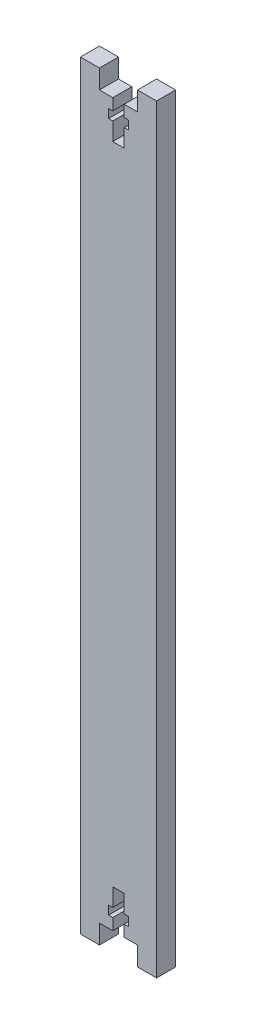
ISO-10303-21;
HEADER;
FILE_DESCRIPTION(('STEP AP214'),'2;1');
FILE_NAME('part.step','',(''),(''),'','','');
FILE_SCHEMA(('AUTOMOTIVE_DESIGN { 1 0 10303 214 1 1 1 1 }'));
ENDSEC;
DATA;
#1=APPLICATION_CONTEXT('core data for automotive mechanical design processes');
#2=APPLICATION_PROTOCOL_DEFINITION('international standard','automotive_design',2000,#1);
#3=PRODUCT_CONTEXT('',#1,'mechanical');
#4=PRODUCT('Part','Part','',(#3));
#5=PRODUCT_RELATED_PRODUCT_CATEGORY('part','',(#4));
#6=PRODUCT_DEFINITION_FORMATION('','',#4);
#7=PRODUCT_DEFINITION_CONTEXT('part definition',#1,'design');
#8=PRODUCT_DEFINITION('design','',#6,#7);
#9=PRODUCT_DEFINITION_SHAPE('','',#8);
#10=(LENGTH_UNIT() NAMED_UNIT(*) SI_UNIT(.MILLI.,.METRE.));
#11=(NAMED_UNIT(*) PLANE_ANGLE_UNIT() SI_UNIT($,.RADIAN.));
#12=(NAMED_UNIT(*) SI_UNIT($,.STERADIAN.) SOLID_ANGLE_UNIT());
#13=UNCERTAINTY_MEASURE_WITH_UNIT(LENGTH_MEASURE(1.E-05),#10,'distance_accuracy_value','');
#14=(GEOMETRIC_REPRESENTATION_CONTEXT(3) GLOBAL_UNCERTAINTY_ASSIGNED_CONTEXT((#13)) GLOBAL_UNIT_ASSIGNED_CONTEXT((#10,
#11,#12)) REPRESENTATION_CONTEXT('',''));
#15=CARTESIAN_POINT('',(0.,0.,0.));
#16=DIRECTION('',(0.,0.,1.));
#17=DIRECTION('',(1.,0.,0.));
#18=AXIS2_PLACEMENT_3D('',#15,#16,#17);
#19=CARTESIAN_POINT('',(-20.,0.,5.));
#20=DIRECTION('',(1.,0.,0.));
#21=DIRECTION('',(0.,0.,-1.));
#22=AXIS2_PLACEMENT_3D('',#19,#20,#21);
#23=PLANE('',#22);
#24=DIRECTION('',(0.,-1.,0.));
#25=VECTOR('',#24,1.);
#26=CARTESIAN_POINT('',(-20.,0.,0.));
#27=LINE('',#26,#25);
#28=CARTESIAN_POINT('',(-20.,199.5,0.));
#29=VERTEX_POINT('',#28);
#30=CARTESIAN_POINT('',(-20.,0.,0.));
#31=VERTEX_POINT('',#30);
#32=EDGE_CURVE('E171',#29,#31,#27,.T.);
#33=ORIENTED_EDGE('',*,*,#32,.T.);
#34=DIRECTION('',(0.,0.,-1.));
#35=VECTOR('',#34,1.);
#36=CARTESIAN_POINT('',(-20.,0.,5.));
#37=LINE('',#36,#35);
#38=CARTESIAN_POINT('',(-20.,0.,5.));
#39=VERTEX_POINT('',#38);
#40=EDGE_CURVE('E12',#39,#31,#37,.T.);
#41=ORIENTED_EDGE('',*,*,#40,.F.);
#42=DIRECTION('',(0.,-1.,0.));
#43=VECTOR('',#42,1.);
#44=CARTESIAN_POINT('',(-20.,199.5,5.));
#45=LINE('',#44,#43);
#46=CARTESIAN_POINT('',(-20.,199.5,5.));
#47=VERTEX_POINT('',#46);
#48=EDGE_CURVE('E177',#47,#39,#45,.T.);
#49=ORIENTED_EDGE('',*,*,#48,.F.);
#50=DIRECTION('',(0.,0.,-1.));
#51=VECTOR('',#50,1.);
#52=CARTESIAN_POINT('',(-20.,199.5,5.));
#53=LINE('',#52,#51);
#54=EDGE_CURVE('E295',#47,#29,#53,.T.);
#55=ORIENTED_EDGE('',*,*,#54,.T.);
#56=EDGE_LOOP('',(#33,#41,#49,#55));
#57=FACE_BOUND('',#56,.T.);
#58=ADVANCED_FACE('F35',(#57),#23,.F.);
#59=CARTESIAN_POINT('',(-15.,0.,5.));
#60=DIRECTION('',(0.,1.,0.));
#61=DIRECTION('',(0.,0.,1.));
#62=AXIS2_PLACEMENT_3D('',#59,#60,#61);
#63=PLANE('',#62);
#64=DIRECTION('',(1.,0.,0.));
#65=VECTOR('',#64,1.);
#66=CARTESIAN_POINT('',(-15.,0.,0.));
#67=LINE('',#66,#65);
#68=CARTESIAN_POINT('',(-15.,0.,0.));
#69=VERTEX_POINT('',#68);
#70=EDGE_CURVE('E542',#31,#69,#67,.T.);
#71=ORIENTED_EDGE('',*,*,#70,.T.);
#72=DIRECTION('',(0.,0.,-1.));
#73=VECTOR('',#72,1.);
#74=CARTESIAN_POINT('',(-15.,0.,5.));
#75=LINE('',#74,#73);
#76=CARTESIAN_POINT('',(-15.,0.,5.));
#77=VERTEX_POINT('',#76);
#78=EDGE_CURVE('E43',#77,#69,#75,.T.);
#79=ORIENTED_EDGE('',*,*,#78,.F.);
#80=DIRECTION('',(1.,0.,0.));
#81=VECTOR('',#80,1.);
#82=CARTESIAN_POINT('',(-15.,0.,5.));
#83=LINE('',#82,#81);
#84=EDGE_CURVE('E425',#39,#77,#83,.T.);
#85=ORIENTED_EDGE('',*,*,#84,.F.);
#86=ORIENTED_EDGE('',*,*,#40,.T.);
#87=EDGE_LOOP('',(#71,#79,#85,#86));
#88=FACE_BOUND('',#87,.T.);
#89=ADVANCED_FACE('F752',(#88),#63,.F.);
#90=CARTESIAN_POINT('',(-15.,0.,5.));
#91=DIRECTION('',(-1.,0.,0.));
#92=DIRECTION('',(0.,0.,1.));
#93=AXIS2_PLACEMENT_3D('',#90,#91,#92);
#94=PLANE('',#93);
#95=DIRECTION('',(0.,1.,0.));
#96=VECTOR('',#95,1.);
#97=CARTESIAN_POINT('',(-15.,0.,0.));
#98=LINE('',#97,#96);
#99=CARTESIAN_POINT('',(-15.,5.,0.));
#100=VERTEX_POINT('',#99);
#101=EDGE_CURVE('E537',#69,#100,#98,.T.);
#102=ORIENTED_EDGE('',*,*,#101,.T.);
#103=DIRECTION('',(0.,0.,-1.));
#104=VECTOR('',#103,1.);
#105=CARTESIAN_POINT('',(-15.,5.,5.));
#106=LINE('',#105,#104);
#107=CARTESIAN_POINT('',(-15.,5.,5.));
#108=VERTEX_POINT('',#107);
#109=EDGE_CURVE('E528',#108,#100,#106,.T.);
#110=ORIENTED_EDGE('',*,*,#109,.F.);
#111=DIRECTION('',(0.,1.,0.));
#112=VECTOR('',#111,1.);
#113=CARTESIAN_POINT('',(-15.,0.,5.));
#114=LINE('',#113,#112);
#115=EDGE_CURVE('E422',#77,#108,#114,.T.);
#116=ORIENTED_EDGE('',*,*,#115,.F.);
#117=ORIENTED_EDGE('',*,*,#78,.T.);
#118=EDGE_LOOP('',(#102,#110,#116,#117));
#119=FACE_BOUND('',#118,.T.);
#120=ADVANCED_FACE('F535',(#119),#94,.F.);
#121=CARTESIAN_POINT('',(-11.5,5.,5.));
#122=DIRECTION('',(0.,1.,0.));
#123=DIRECTION('',(-1.,0.,0.));
#124=AXIS2_PLACEMENT_3D('',#121,#122,#123);
#125=PLANE('',#124);
#126=DIRECTION('',(1.,0.,0.));
#127=VECTOR('',#126,1.);
#128=CARTESIAN_POINT('',(-11.5,5.,0.));
#129=LINE('',#128,#127);
#130=CARTESIAN_POINT('',(-11.5,5.,0.));
#131=VERTEX_POINT('',#130);
#132=EDGE_CURVE('E544',#100,#131,#129,.T.);
#133=ORIENTED_EDGE('',*,*,#132,.T.);
#134=DIRECTION('',(0.,0.,-1.));
#135=VECTOR('',#134,1.);
#136=CARTESIAN_POINT('',(-11.5,5.,5.));
#137=LINE('',#136,#135);
#138=CARTESIAN_POINT('',(-11.5,5.,5.));
#139=VERTEX_POINT('',#138);
#140=EDGE_CURVE('E525',#139,#131,#137,.T.);
#141=ORIENTED_EDGE('',*,*,#140,.F.);
#142=DIRECTION('',(1.,0.,0.));
#143=VECTOR('',#142,1.);
#144=CARTESIAN_POINT('',(-11.5,5.,5.));
#145=LINE('',#144,#143);
#146=EDGE_CURVE('E419',#108,#139,#145,.T.);
#147=ORIENTED_EDGE('',*,*,#146,.F.);
#148=ORIENTED_EDGE('',*,*,#109,.T.);
#149=EDGE_LOOP('',(#133,#141,#147,#148));
#150=FACE_BOUND('',#149,.T.);
#151=ADVANCED_FACE('F751',(#150),#125,.F.);
#152=CARTESIAN_POINT('',(-11.5,8.,5.));
#153=DIRECTION('',(-1.,0.,0.));
#154=DIRECTION('',(0.,-1.,0.));
#155=AXIS2_PLACEMENT_3D('',#152,#153,#154);
#156=PLANE('',#155);
#157=DIRECTION('',(0.,1.,0.));
#158=VECTOR('',#157,1.);
#159=CARTESIAN_POINT('',(-11.5,8.,0.));
#160=LINE('',#159,#158);
#161=CARTESIAN_POINT('',(-11.5,8.,0.));
#162=VERTEX_POINT('',#161);
#163=EDGE_CURVE('E546',#131,#162,#160,.T.);
#164=ORIENTED_EDGE('',*,*,#163,.T.);
#165=DIRECTION('',(0.,0.,-1.));
#166=VECTOR('',#165,1.);
#167=CARTESIAN_POINT('',(-11.5,8.,5.));
#168=LINE('',#167,#166);
#169=CARTESIAN_POINT('',(-11.5,8.,5.));
#170=VERTEX_POINT('',#169);
#171=EDGE_CURVE('E522',#170,#162,#168,.T.);
#172=ORIENTED_EDGE('',*,*,#171,.F.);
#173=DIRECTION('',(0.,1.,0.));
#174=VECTOR('',#173,1.);
#175=CARTESIAN_POINT('',(-11.5,8.,5.));
#176=LINE('',#175,#174);
#177=EDGE_CURVE('E417',#139,#170,#176,.T.);
#178=ORIENTED_EDGE('',*,*,#177,.F.);
#179=ORIENTED_EDGE('',*,*,#140,.T.);
#180=EDGE_LOOP('',(#164,#172,#178,#179));
#181=FACE_BOUND('',#180,.T.);
#182=ADVANCED_FACE('F746',(#181),#156,.F.);
#183=CARTESIAN_POINT('',(-11.5,8.,5.));
#184=DIRECTION('',(0.,-1.,0.));
#185=DIRECTION('',(1.,0.,0.));
#186=AXIS2_PLACEMENT_3D('',#183,#184,#185);
#187=PLANE('',#186);
#188=DIRECTION('',(-1.,0.,0.));
#189=VECTOR('',#188,1.);
#190=CARTESIAN_POINT('',(-11.5,8.,0.));
#191=LINE('',#190,#189);
#192=CARTESIAN_POINT('',(-12.6,8.00000000000001,0.));
#193=VERTEX_POINT('',#192);
#194=EDGE_CURVE('E551',#162,#193,#191,.T.);
#195=ORIENTED_EDGE('',*,*,#194,.T.);
#196=DIRECTION('',(0.,0.,-1.));
#197=VECTOR('',#196,1.);
#198=CARTESIAN_POINT('',(-12.6,8.00000000000001,5.));
#199=LINE('',#198,#197);
#200=CARTESIAN_POINT('',(-12.6,8.00000000000001,5.));
#201=VERTEX_POINT('',#200);
#202=EDGE_CURVE('E519',#201,#193,#199,.T.);
#203=ORIENTED_EDGE('',*,*,#202,.F.);
#204=DIRECTION('',(-1.,0.,0.));
#205=VECTOR('',#204,1.);
#206=CARTESIAN_POINT('',(-11.5,8.,5.));
#207=LINE('',#206,#205);
#208=EDGE_CURVE('E409',#170,#201,#207,.T.);
#209=ORIENTED_EDGE('',*,*,#208,.F.);
#210=ORIENTED_EDGE('',*,*,#171,.T.);
#211=EDGE_LOOP('',(#195,#203,#209,#210));
#212=FACE_BOUND('',#211,.T.);
#213=ADVANCED_FACE('F743',(#212),#187,.F.);
#214=CARTESIAN_POINT('',(-12.6,8.00000000000001,5.));
#215=DIRECTION('',(-1.,0.,0.));
#216=DIRECTION('',(0.,-1.,0.));
#217=AXIS2_PLACEMENT_3D('',#214,#215,#216);
#218=PLANE('',#217);
#219=DIRECTION('',(0.,1.,0.));
#220=VECTOR('',#219,1.);
#221=CARTESIAN_POINT('',(-12.6,8.00000000000001,0.));
#222=LINE('',#221,#220);
#223=CARTESIAN_POINT('',(-12.6,10.3,0.));
#224=VERTEX_POINT('',#223);
#225=EDGE_CURVE('E553',#193,#224,#222,.T.);
#226=ORIENTED_EDGE('',*,*,#225,.T.);
#227=DIRECTION('',(0.,0.,-1.));
#228=VECTOR('',#227,1.);
#229=CARTESIAN_POINT('',(-12.6,10.3,5.));
#230=LINE('',#229,#228);
#231=CARTESIAN_POINT('',(-12.6,10.3,5.));
#232=VERTEX_POINT('',#231);
#233=EDGE_CURVE('E516',#232,#224,#230,.T.);
#234=ORIENTED_EDGE('',*,*,#233,.F.);
#235=DIRECTION('',(0.,1.,0.));
#236=VECTOR('',#235,1.);
#237=CARTESIAN_POINT('',(-12.6,8.00000000000001,5.));
#238=LINE('',#237,#236);
#239=EDGE_CURVE('E406',#201,#232,#238,.T.);
#240=ORIENTED_EDGE('',*,*,#239,.F.);
#241=ORIENTED_EDGE('',*,*,#202,.T.);
#242=EDGE_LOOP('',(#226,#234,#240,#241));
#243=FACE_BOUND('',#242,.T.);
#244=ADVANCED_FACE('F739',(#243),#218,.F.);
#245=CARTESIAN_POINT('',(-12.6,10.3,5.));
#246=DIRECTION('',(0.,1.,0.));
#247=DIRECTION('',(-1.,0.,0.));
#248=AXIS2_PLACEMENT_3D('',#245,#246,#247);
#249=PLANE('',#248);
#250=DIRECTION('',(1.,0.,0.));
#251=VECTOR('',#250,1.);
#252=CARTESIAN_POINT('',(-12.6,10.3,0.));
#253=LINE('',#252,#251);
#254=CARTESIAN_POINT('',(-11.5,10.3,0.));
#255=VERTEX_POINT('',#254);
#256=EDGE_CURVE('E555',#224,#255,#253,.T.);
#257=ORIENTED_EDGE('',*,*,#256,.T.);
#258=DIRECTION('',(0.,0.,-1.));
#259=VECTOR('',#258,1.);
#260=CARTESIAN_POINT('',(-11.5,10.3,5.));
#261=LINE('',#260,#259);
#262=CARTESIAN_POINT('',(-11.5,10.3,5.));
#263=VERTEX_POINT('',#262);
#264=EDGE_CURVE('E513',#263,#255,#261,.T.);
#265=ORIENTED_EDGE('',*,*,#264,.F.);
#266=DIRECTION('',(1.,0.,0.));
#267=VECTOR('',#266,1.);
#268=CARTESIAN_POINT('',(-12.6,10.3,5.));
#269=LINE('',#268,#267);
#270=EDGE_CURVE('E403',#232,#263,#269,.T.);
#271=ORIENTED_EDGE('',*,*,#270,.F.);
#272=ORIENTED_EDGE('',*,*,#233,.T.);
#273=EDGE_LOOP('',(#257,#265,#271,#272));
#274=FACE_BOUND('',#273,.T.);
#275=ADVANCED_FACE('F734',(#274),#249,.F.);
#276=CARTESIAN_POINT('',(-11.5,15.,5.));
#277=DIRECTION('',(-1.,0.,0.));
#278=DIRECTION('',(0.,-1.,0.));
#279=AXIS2_PLACEMENT_3D('',#276,#277,#278);
#280=PLANE('',#279);
#281=DIRECTION('',(0.,1.,0.));
#282=VECTOR('',#281,1.);
#283=CARTESIAN_POINT('',(-11.5,15.,0.));
#284=LINE('',#283,#282);
#285=CARTESIAN_POINT('',(-11.5,15.,0.));
#286=VERTEX_POINT('',#285);
#287=EDGE_CURVE('E557',#255,#286,#284,.T.);
#288=ORIENTED_EDGE('',*,*,#287,.T.);
#289=DIRECTION('',(0.,0.,-1.));
#290=VECTOR('',#289,1.);
#291=CARTESIAN_POINT('',(-11.5,15.,5.));
#292=LINE('',#291,#290);
#293=CARTESIAN_POINT('',(-11.5,15.,5.));
#294=VERTEX_POINT('',#293);
#295=EDGE_CURVE('E510',#294,#286,#292,.T.);
#296=ORIENTED_EDGE('',*,*,#295,.F.);
#297=DIRECTION('',(0.,1.,0.));
#298=VECTOR('',#297,1.);
#299=CARTESIAN_POINT('',(-11.5,15.,5.));
#300=LINE('',#299,#298);
#301=EDGE_CURVE('E401',#263,#294,#300,.T.);
#302=ORIENTED_EDGE('',*,*,#301,.F.);
#303=ORIENTED_EDGE('',*,*,#264,.T.);
#304=EDGE_LOOP('',(#288,#296,#302,#303));
#305=FACE_BOUND('',#304,.T.);
#306=ADVANCED_FACE('F728',(#305),#280,.F.);
#307=CARTESIAN_POINT('',(-8.5,15.,5.));
#308=DIRECTION('',(0.,1.,0.));
#309=DIRECTION('',(0.,0.,1.));
#310=AXIS2_PLACEMENT_3D('',#307,#308,#309);
#311=PLANE('',#310);
#312=DIRECTION('',(1.,0.,0.));
#313=VECTOR('',#312,1.);
#314=CARTESIAN_POINT('',(-8.5,15.,0.));
#315=LINE('',#314,#313);
#316=CARTESIAN_POINT('',(-8.5,15.,0.));
#317=VERTEX_POINT('',#316);
#318=EDGE_CURVE('E559',#286,#317,#315,.T.);
#319=ORIENTED_EDGE('',*,*,#318,.T.);
#320=DIRECTION('',(0.,0.,-1.));
#321=VECTOR('',#320,1.);
#322=CARTESIAN_POINT('',(-8.5,15.,5.));
#323=LINE('',#322,#321);
#324=CARTESIAN_POINT('',(-8.5,15.,5.));
#325=VERTEX_POINT('',#324);
#326=EDGE_CURVE('E507',#325,#317,#323,.T.);
#327=ORIENTED_EDGE('',*,*,#326,.F.);
#328=DIRECTION('',(1.,0.,0.));
#329=VECTOR('',#328,1.);
#330=CARTESIAN_POINT('',(-8.5,15.,5.));
#331=LINE('',#330,#329);
#332=EDGE_CURVE('E393',#294,#325,#331,.T.);
#333=ORIENTED_EDGE('',*,*,#332,.F.);
#334=ORIENTED_EDGE('',*,*,#295,.T.);
#335=EDGE_LOOP('',(#319,#327,#333,#334));
#336=FACE_BOUND('',#335,.T.);
#337=ADVANCED_FACE('F724',(#336),#311,.F.);
#338=CARTESIAN_POINT('',(-8.5,10.3,5.));
#339=DIRECTION('',(1.,0.,0.));
#340=DIRECTION('',(0.,0.,-1.));
#341=AXIS2_PLACEMENT_3D('',#338,#339,#340);
#342=PLANE('',#341);
#343=DIRECTION('',(0.,-1.,0.));
#344=VECTOR('',#343,1.);
#345=CARTESIAN_POINT('',(-8.5,10.3,0.));
#346=LINE('',#345,#344);
#347=CARTESIAN_POINT('',(-8.5,10.3,0.));
#348=VERTEX_POINT('',#347);
#349=EDGE_CURVE('E561',#317,#348,#346,.T.);
#350=ORIENTED_EDGE('',*,*,#349,.T.);
#351=DIRECTION('',(0.,0.,-1.));
#352=VECTOR('',#351,1.);
#353=CARTESIAN_POINT('',(-8.5,10.3,5.));
#354=LINE('',#353,#352);
#355=CARTESIAN_POINT('',(-8.5,10.3,5.));
#356=VERTEX_POINT('',#355);
#357=EDGE_CURVE('E504',#356,#348,#354,.T.);
#358=ORIENTED_EDGE('',*,*,#357,.F.);
#359=DIRECTION('',(0.,-1.,0.));
#360=VECTOR('',#359,1.);
#361=CARTESIAN_POINT('',(-8.5,10.3,5.));
#362=LINE('',#361,#360);
#363=EDGE_CURVE('E390',#325,#356,#362,.T.);
#364=ORIENTED_EDGE('',*,*,#363,.F.);
#365=ORIENTED_EDGE('',*,*,#326,.T.);
#366=EDGE_LOOP('',(#350,#358,#364,#365));
#367=FACE_BOUND('',#366,.T.);
#368=ADVANCED_FACE('F719',(#367),#342,.F.);
#369=CARTESIAN_POINT('',(-8.5,10.3,5.));
#370=DIRECTION('',(0.,1.,0.));
#371=DIRECTION('',(-1.,0.,0.));
#372=AXIS2_PLACEMENT_3D('',#369,#370,#371);
#373=PLANE('',#372);
#374=DIRECTION('',(1.,0.,0.));
#375=VECTOR('',#374,1.);
#376=CARTESIAN_POINT('',(-8.5,10.3,0.));
#377=LINE('',#376,#375);
#378=CARTESIAN_POINT('',(-7.4,10.3,0.));
#379=VERTEX_POINT('',#378);
#380=EDGE_CURVE('E563',#348,#379,#377,.T.);
#381=ORIENTED_EDGE('',*,*,#380,.T.);
#382=DIRECTION('',(0.,0.,-1.));
#383=VECTOR('',#382,1.);
#384=CARTESIAN_POINT('',(-7.4,10.3,5.));
#385=LINE('',#384,#383);
#386=CARTESIAN_POINT('',(-7.4,10.3,5.));
#387=VERTEX_POINT('',#386);
#388=EDGE_CURVE('E501',#387,#379,#385,.T.);
#389=ORIENTED_EDGE('',*,*,#388,.F.);
#390=DIRECTION('',(1.,0.,0.));
#391=VECTOR('',#390,1.);
#392=CARTESIAN_POINT('',(-8.5,10.3,5.));
#393=LINE('',#392,#391);
#394=EDGE_CURVE('E387',#356,#387,#393,.T.);
#395=ORIENTED_EDGE('',*,*,#394,.F.);
#396=ORIENTED_EDGE('',*,*,#357,.T.);
#397=EDGE_LOOP('',(#381,#389,#395,#396));
#398=FACE_BOUND('',#397,.T.);
#399=ADVANCED_FACE('F713',(#398),#373,.F.);
#400=CARTESIAN_POINT('',(-7.4,10.3,5.));
#401=DIRECTION('',(1.,0.,0.));
#402=DIRECTION('',(0.,1.,0.));
#403=AXIS2_PLACEMENT_3D('',#400,#401,#402);
#404=PLANE('',#403);
#405=DIRECTION('',(0.,-1.,0.));
#406=VECTOR('',#405,1.);
#407=CARTESIAN_POINT('',(-7.4,10.3,0.));
#408=LINE('',#407,#406);
#409=CARTESIAN_POINT('',(-7.4,8.,0.));
#410=VERTEX_POINT('',#409);
#411=EDGE_CURVE('E565',#379,#410,#408,.T.);
#412=ORIENTED_EDGE('',*,*,#411,.T.);
#413=DIRECTION('',(0.,0.,-1.));
#414=VECTOR('',#413,1.);
#415=CARTESIAN_POINT('',(-7.4,8.,5.));
#416=LINE('',#415,#414);
#417=CARTESIAN_POINT('',(-7.4,8.,5.));
#418=VERTEX_POINT('',#417);
#419=EDGE_CURVE('E498',#418,#410,#416,.T.);
#420=ORIENTED_EDGE('',*,*,#419,.F.);
#421=DIRECTION('',(0.,-1.,0.));
#422=VECTOR('',#421,1.);
#423=CARTESIAN_POINT('',(-7.4,10.3,5.));
#424=LINE('',#423,#422);
#425=EDGE_CURVE('E385',#387,#418,#424,.T.);
#426=ORIENTED_EDGE('',*,*,#425,.F.);
#427=ORIENTED_EDGE('',*,*,#388,.T.);
#428=EDGE_LOOP('',(#412,#420,#426,#427));
#429=FACE_BOUND('',#428,.T.);
#430=ADVANCED_FACE('F709',(#429),#404,.F.);
#431=CARTESIAN_POINT('',(-7.4,8.,5.));
#432=DIRECTION('',(0.,-1.,0.));
#433=DIRECTION('',(0.,0.,-1.));
#434=AXIS2_PLACEMENT_3D('',#431,#432,#433);
#435=PLANE('',#434);
#436=DIRECTION('',(-1.,0.,0.));
#437=VECTOR('',#436,1.);
#438=CARTESIAN_POINT('',(-7.4,8.,0.));
#439=LINE('',#438,#437);
#440=CARTESIAN_POINT('',(-8.5,8.,0.));
#441=VERTEX_POINT('',#440);
#442=EDGE_CURVE('E567',#410,#441,#439,.T.);
#443=ORIENTED_EDGE('',*,*,#442,.T.);
#444=DIRECTION('',(0.,0.,-1.));
#445=VECTOR('',#444,1.);
#446=CARTESIAN_POINT('',(-8.5,8.,5.));
#447=LINE('',#446,#445);
#448=CARTESIAN_POINT('',(-8.5,8.,5.));
#449=VERTEX_POINT('',#448);
#450=EDGE_CURVE('E495',#449,#441,#447,.T.);
#451=ORIENTED_EDGE('',*,*,#450,.F.);
#452=DIRECTION('',(-1.,0.,0.));
#453=VECTOR('',#452,1.);
#454=CARTESIAN_POINT('',(-7.4,8.,5.));
#455=LINE('',#454,#453);
#456=EDGE_CURVE('E377',#418,#449,#455,.T.);
#457=ORIENTED_EDGE('',*,*,#456,.F.);
#458=ORIENTED_EDGE('',*,*,#419,.T.);
#459=EDGE_LOOP('',(#443,#451,#457,#458));
#460=FACE_BOUND('',#459,.T.);
#461=ADVANCED_FACE('F704',(#460),#435,.F.);
#462=CARTESIAN_POINT('',(-8.5,5.,5.));
#463=DIRECTION('',(1.,0.,0.));
#464=DIRECTION('',(0.,1.,0.));
#465=AXIS2_PLACEMENT_3D('',#462,#463,#464);
#466=PLANE('',#465);
#467=DIRECTION('',(0.,-1.,0.));
#468=VECTOR('',#467,1.);
#469=CARTESIAN_POINT('',(-8.5,5.,0.));
#470=LINE('',#469,#468);
#471=CARTESIAN_POINT('',(-8.5,5.,0.));
#472=VERTEX_POINT('',#471);
#473=EDGE_CURVE('E569',#441,#472,#470,.T.);
#474=ORIENTED_EDGE('',*,*,#473,.T.);
#475=DIRECTION('',(0.,0.,-1.));
#476=VECTOR('',#475,1.);
#477=CARTESIAN_POINT('',(-8.5,5.,5.));
#478=LINE('',#477,#476);
#479=CARTESIAN_POINT('',(-8.5,5.,5.));
#480=VERTEX_POINT('',#479);
#481=EDGE_CURVE('E492',#480,#472,#478,.T.);
#482=ORIENTED_EDGE('',*,*,#481,.F.);
#483=DIRECTION('',(0.,-1.,0.));
#484=VECTOR('',#483,1.);
#485=CARTESIAN_POINT('',(-8.5,5.,5.));
#486=LINE('',#485,#484);
#487=EDGE_CURVE('E374',#449,#480,#486,.T.);
#488=ORIENTED_EDGE('',*,*,#487,.F.);
#489=ORIENTED_EDGE('',*,*,#450,.T.);
#490=EDGE_LOOP('',(#474,#482,#488,#489));
#491=FACE_BOUND('',#490,.T.);
#492=ADVANCED_FACE('F698',(#491),#466,.F.);
#493=CARTESIAN_POINT('',(-8.5,5.,5.));
#494=DIRECTION('',(0.,1.,0.));
#495=DIRECTION('',(0.,0.,1.));
#496=AXIS2_PLACEMENT_3D('',#493,#494,#495);
#497=PLANE('',#496);
#498=DIRECTION('',(1.,0.,0.));
#499=VECTOR('',#498,1.);
#500=CARTESIAN_POINT('',(-8.5,5.,0.));
#501=LINE('',#500,#499);
#502=CARTESIAN_POINT('',(-5.,5.,0.));
#503=VERTEX_POINT('',#502);
#504=EDGE_CURVE('E571',#472,#503,#501,.T.);
#505=ORIENTED_EDGE('',*,*,#504,.T.);
#506=DIRECTION('',(0.,0.,-1.));
#507=VECTOR('',#506,1.);
#508=CARTESIAN_POINT('',(-5.,5.,5.));
#509=LINE('',#508,#507);
#510=CARTESIAN_POINT('',(-5.,5.,5.));
#511=VERTEX_POINT('',#510);
#512=EDGE_CURVE('E489',#511,#503,#509,.T.);
#513=ORIENTED_EDGE('',*,*,#512,.F.);
#514=DIRECTION('',(1.,0.,0.));
#515=VECTOR('',#514,1.);
#516=CARTESIAN_POINT('',(-8.5,5.,5.));
#517=LINE('',#516,#515);
#518=EDGE_CURVE('E371',#480,#511,#517,.T.);
#519=ORIENTED_EDGE('',*,*,#518,.F.);
#520=ORIENTED_EDGE('',*,*,#481,.T.);
#521=EDGE_LOOP('',(#505,#513,#519,#520));
#522=FACE_BOUND('',#521,.T.);
#523=ADVANCED_FACE('F694',(#522),#497,.F.);
#524=CARTESIAN_POINT('',(-5.,5.,5.));
#525=DIRECTION('',(1.,0.,0.));
#526=DIRECTION('',(0.,1.,0.));
#527=AXIS2_PLACEMENT_3D('',#524,#525,#526);
#528=PLANE('',#527);
#529=DIRECTION('',(0.,-1.,0.));
#530=VECTOR('',#529,1.);
#531=CARTESIAN_POINT('',(-5.,5.,0.));
#532=LINE('',#531,#530);
#533=CARTESIAN_POINT('',(-5.,0.,0.));
#534=VERTEX_POINT('',#533);
#535=EDGE_CURVE('E573',#503,#534,#532,.T.);
#536=ORIENTED_EDGE('',*,*,#535,.T.);
#537=DIRECTION('',(0.,0.,-1.));
#538=VECTOR('',#537,1.);
#539=CARTESIAN_POINT('',(-5.,0.,5.));
#540=LINE('',#539,#538);
#541=CARTESIAN_POINT('',(-5.,0.,5.));
#542=VERTEX_POINT('',#541);
#543=EDGE_CURVE('E486',#542,#534,#540,.T.);
#544=ORIENTED_EDGE('',*,*,#543,.F.);
#545=DIRECTION('',(0.,-1.,0.));
#546=VECTOR('',#545,1.);
#547=CARTESIAN_POINT('',(-5.,5.,5.));
#548=LINE('',#547,#546);
#549=EDGE_CURVE('E369',#511,#542,#548,.T.);
#550=ORIENTED_EDGE('',*,*,#549,.F.);
#551=ORIENTED_EDGE('',*,*,#512,.T.);
#552=EDGE_LOOP('',(#536,#544,#550,#551));
#553=FACE_BOUND('',#552,.T.);
#554=ADVANCED_FACE('F689',(#553),#528,.F.);
#555=CARTESIAN_POINT('',(-5.,0.,5.));
#556=DIRECTION('',(0.,1.,0.));
#557=DIRECTION('',(0.,0.,1.));
#558=AXIS2_PLACEMENT_3D('',#555,#556,#557);
#559=PLANE('',#558);
#560=DIRECTION('',(1.,0.,0.));
#561=VECTOR('',#560,1.);
#562=CARTESIAN_POINT('',(-5.,0.,0.));
#563=LINE('',#562,#561);
#564=CARTESIAN_POINT('',(0.,0.,0.));
#565=VERTEX_POINT('',#564);
#566=EDGE_CURVE('E575',#534,#565,#563,.T.);
#567=ORIENTED_EDGE('',*,*,#566,.T.);
#568=DIRECTION('',(0.,0.,-1.));
#569=VECTOR('',#568,1.);
#570=CARTESIAN_POINT('',(0.,0.,5.));
#571=LINE('',#570,#569);
#572=CARTESIAN_POINT('',(0.,0.,5.));
#573=VERTEX_POINT('',#572);
#574=EDGE_CURVE('E483',#573,#565,#571,.T.);
#575=ORIENTED_EDGE('',*,*,#574,.F.);
#576=DIRECTION('',(1.,0.,0.));
#577=VECTOR('',#576,1.);
#578=CARTESIAN_POINT('',(-5.,0.,5.));
#579=LINE('',#578,#577);
#580=EDGE_CURVE('E361',#542,#573,#579,.T.);
#581=ORIENTED_EDGE('',*,*,#580,.F.);
#582=ORIENTED_EDGE('',*,*,#543,.T.);
#583=EDGE_LOOP('',(#567,#575,#581,#582));
#584=FACE_BOUND('',#583,.T.);
#585=ADVANCED_FACE('F683',(#584),#559,.F.);
#586=CARTESIAN_POINT('',(0.,199.5,5.));
#587=DIRECTION('',(-1.,0.,0.));
#588=DIRECTION('',(0.,-1.,0.));
#589=AXIS2_PLACEMENT_3D('',#586,#587,#588);
#590=PLANE('',#589);
#591=DIRECTION('',(0.,1.,0.));
#592=VECTOR('',#591,1.);
#593=CARTESIAN_POINT('',(0.,199.5,0.));
#594=LINE('',#593,#592);
#595=CARTESIAN_POINT('',(0.,199.5,0.));
#596=VERTEX_POINT('',#595);
#597=EDGE_CURVE('E578',#565,#596,#594,.T.);
#598=ORIENTED_EDGE('',*,*,#597,.T.);
#599=DIRECTION('',(0.,0.,-1.));
#600=VECTOR('',#599,1.);
#601=CARTESIAN_POINT('',(0.,199.5,5.));
#602=LINE('',#601,#600);
#603=CARTESIAN_POINT('',(0.,199.5,5.));
#604=VERTEX_POINT('',#603);
#605=EDGE_CURVE('E480',#604,#596,#602,.T.);
#606=ORIENTED_EDGE('',*,*,#605,.F.);
#607=DIRECTION('',(0.,1.,0.));
#608=VECTOR('',#607,1.);
#609=CARTESIAN_POINT('',(0.,0.,5.));
#610=LINE('',#609,#608);
#611=EDGE_CURVE('E358',#573,#604,#610,.T.);
#612=ORIENTED_EDGE('',*,*,#611,.F.);
#613=ORIENTED_EDGE('',*,*,#574,.T.);
#614=EDGE_LOOP('',(#598,#606,#612,#613));
#615=FACE_BOUND('',#614,.T.);
#616=ADVANCED_FACE('F679',(#615),#590,.F.);
#617=CARTESIAN_POINT('',(-4.99999999999997,199.5,5.));
#618=DIRECTION('',(0.,-1.,0.));
#619=DIRECTION('',(0.,0.,-1.));
#620=AXIS2_PLACEMENT_3D('',#617,#618,#619);
#621=PLANE('',#620);
#622=DIRECTION('',(-1.,0.,0.));
#623=VECTOR('',#622,1.);
#624=CARTESIAN_POINT('',(-4.99999999999997,199.5,0.));
#625=LINE('',#624,#623);
#626=CARTESIAN_POINT('',(-4.99999999999997,199.5,0.));
#627=VERTEX_POINT('',#626);
#628=EDGE_CURVE('E580',#596,#627,#625,.T.);
#629=ORIENTED_EDGE('',*,*,#628,.T.);
#630=DIRECTION('',(0.,0.,-1.));
#631=VECTOR('',#630,1.);
#632=CARTESIAN_POINT('',(-4.99999999999997,199.5,5.));
#633=LINE('',#632,#631);
#634=CARTESIAN_POINT('',(-4.99999999999997,199.5,5.));
#635=VERTEX_POINT('',#634);
#636=EDGE_CURVE('E477',#635,#627,#633,.T.);
#637=ORIENTED_EDGE('',*,*,#636,.F.);
#638=DIRECTION('',(-1.,0.,0.));
#639=VECTOR('',#638,1.);
#640=CARTESIAN_POINT('',(-4.99999999999997,199.5,5.));
#641=LINE('',#640,#639);
#642=EDGE_CURVE('E355',#604,#635,#641,.T.);
#643=ORIENTED_EDGE('',*,*,#642,.F.);
#644=ORIENTED_EDGE('',*,*,#605,.T.);
#645=EDGE_LOOP('',(#629,#637,#643,#644));
#646=FACE_BOUND('',#645,.T.);
#647=ADVANCED_FACE('F674',(#646),#621,.F.);
#648=CARTESIAN_POINT('',(-4.99999999999997,199.5,5.));
#649=DIRECTION('',(1.,0.,0.));
#650=DIRECTION('',(0.,1.,0.));
#651=AXIS2_PLACEMENT_3D('',#648,#649,#650);
#652=PLANE('',#651);
#653=DIRECTION('',(0.,-1.,0.));
#654=VECTOR('',#653,1.);
#655=CARTESIAN_POINT('',(-4.99999999999997,199.5,0.));
#656=LINE('',#655,#654);
#657=CARTESIAN_POINT('',(-4.99999999999997,194.5,0.));
#658=VERTEX_POINT('',#657);
#659=EDGE_CURVE('E582',#627,#658,#656,.T.);
#660=ORIENTED_EDGE('',*,*,#659,.T.);
#661=DIRECTION('',(0.,0.,-1.));
#662=VECTOR('',#661,1.);
#663=CARTESIAN_POINT('',(-4.99999999999997,194.5,5.));
#664=LINE('',#663,#662);
#665=CARTESIAN_POINT('',(-4.99999999999997,194.5,5.));
#666=VERTEX_POINT('',#665);
#667=EDGE_CURVE('E474',#666,#658,#664,.T.);
#668=ORIENTED_EDGE('',*,*,#667,.F.);
#669=DIRECTION('',(0.,-1.,0.));
#670=VECTOR('',#669,1.);
#671=CARTESIAN_POINT('',(-4.99999999999997,199.5,5.));
#672=LINE('',#671,#670);
#673=EDGE_CURVE('E353',#635,#666,#672,.T.);
#674=ORIENTED_EDGE('',*,*,#673,.F.);
#675=ORIENTED_EDGE('',*,*,#636,.T.);
#676=EDGE_LOOP('',(#660,#668,#674,#675));
#677=FACE_BOUND('',#676,.T.);
#678=ADVANCED_FACE('F669',(#677),#652,.F.);
#679=CARTESIAN_POINT('',(-8.49999999999997,194.5,5.));
#680=DIRECTION('',(0.,-1.,0.));
#681=DIRECTION('',(0.,0.,-1.));
#682=AXIS2_PLACEMENT_3D('',#679,#680,#681);
#683=PLANE('',#682);
#684=DIRECTION('',(-1.,0.,0.));
#685=VECTOR('',#684,1.);
#686=CARTESIAN_POINT('',(-8.49999999999997,194.5,0.));
#687=LINE('',#686,#685);
#688=CARTESIAN_POINT('',(-8.49999999999997,194.5,0.));
#689=VERTEX_POINT('',#688);
#690=EDGE_CURVE('E584',#658,#689,#687,.T.);
#691=ORIENTED_EDGE('',*,*,#690,.T.);
#692=DIRECTION('',(0.,0.,-1.));
#693=VECTOR('',#692,1.);
#694=CARTESIAN_POINT('',(-8.49999999999997,194.5,5.));
#695=LINE('',#694,#693);
#696=CARTESIAN_POINT('',(-8.49999999999997,194.5,5.));
#697=VERTEX_POINT('',#696);
#698=EDGE_CURVE('E471',#697,#689,#695,.T.);
#699=ORIENTED_EDGE('',*,*,#698,.F.);
#700=DIRECTION('',(-1.,0.,0.));
#701=VECTOR('',#700,1.);
#702=CARTESIAN_POINT('',(-8.49999999999997,194.5,5.));
#703=LINE('',#702,#701);
#704=EDGE_CURVE('E345',#666,#697,#703,.T.);
#705=ORIENTED_EDGE('',*,*,#704,.F.);
#706=ORIENTED_EDGE('',*,*,#667,.T.);
#707=EDGE_LOOP('',(#691,#699,#705,#706));
#708=FACE_BOUND('',#707,.T.);
#709=ADVANCED_FACE('F665',(#708),#683,.F.);
#710=CARTESIAN_POINT('',(-8.49999999999997,191.5,5.));
#711=DIRECTION('',(1.,0.,0.));
#712=DIRECTION('',(0.,1.,0.));
#713=AXIS2_PLACEMENT_3D('',#710,#711,#712);
#714=PLANE('',#713);
#715=DIRECTION('',(0.,-1.,0.));
#716=VECTOR('',#715,1.);
#717=CARTESIAN_POINT('',(-8.49999999999997,191.5,0.));
#718=LINE('',#717,#716);
#719=CARTESIAN_POINT('',(-8.49999999999997,191.5,0.));
#720=VERTEX_POINT('',#719);
#721=EDGE_CURVE('E586',#689,#720,#718,.T.);
#722=ORIENTED_EDGE('',*,*,#721,.T.);
#723=DIRECTION('',(0.,0.,-1.));
#724=VECTOR('',#723,1.);
#725=CARTESIAN_POINT('',(-8.49999999999997,191.5,5.));
#726=LINE('',#725,#724);
#727=CARTESIAN_POINT('',(-8.49999999999997,191.5,5.));
#728=VERTEX_POINT('',#727);
#729=EDGE_CURVE('E468',#728,#720,#726,.T.);
#730=ORIENTED_EDGE('',*,*,#729,.F.);
#731=DIRECTION('',(0.,-1.,0.));
#732=VECTOR('',#731,1.);
#733=CARTESIAN_POINT('',(-8.49999999999997,191.5,5.));
#734=LINE('',#733,#732);
#735=EDGE_CURVE('E342',#697,#728,#734,.T.);
#736=ORIENTED_EDGE('',*,*,#735,.F.);
#737=ORIENTED_EDGE('',*,*,#698,.T.);
#738=EDGE_LOOP('',(#722,#730,#736,#737));
#739=FACE_BOUND('',#738,.T.);
#740=ADVANCED_FACE('F660',(#739),#714,.F.);
#741=CARTESIAN_POINT('',(-8.49999999999997,191.5,5.));
#742=DIRECTION('',(0.,1.,0.));
#743=DIRECTION('',(0.,0.,1.));
#744=AXIS2_PLACEMENT_3D('',#741,#742,#743);
#745=PLANE('',#744);
#746=DIRECTION('',(1.,0.,0.));
#747=VECTOR('',#746,1.);
#748=CARTESIAN_POINT('',(-8.49999999999997,191.5,0.));
#749=LINE('',#748,#747);
#750=CARTESIAN_POINT('',(-7.40000000000001,191.5,0.));
#751=VERTEX_POINT('',#750);
#752=EDGE_CURVE('E588',#720,#751,#749,.T.);
#753=ORIENTED_EDGE('',*,*,#752,.T.);
#754=DIRECTION('',(0.,0.,-1.));
#755=VECTOR('',#754,1.);
#756=CARTESIAN_POINT('',(-7.40000000000001,191.5,5.));
#757=LINE('',#756,#755);
#758=CARTESIAN_POINT('',(-7.40000000000001,191.5,5.));
#759=VERTEX_POINT('',#758);
#760=EDGE_CURVE('E465',#759,#751,#757,.T.);
#761=ORIENTED_EDGE('',*,*,#760,.F.);
#762=DIRECTION('',(1.,0.,0.));
#763=VECTOR('',#762,1.);
#764=CARTESIAN_POINT('',(-8.49999999999997,191.5,5.));
#765=LINE('',#764,#763);
#766=EDGE_CURVE('E339',#728,#759,#765,.T.);
#767=ORIENTED_EDGE('',*,*,#766,.F.);
#768=ORIENTED_EDGE('',*,*,#729,.T.);
#769=EDGE_LOOP('',(#753,#761,#767,#768));
#770=FACE_BOUND('',#769,.T.);
#771=ADVANCED_FACE('F654',(#770),#745,.F.);
#772=CARTESIAN_POINT('',(-7.40000000000001,191.5,5.));
#773=DIRECTION('',(1.,0.,0.));
#774=DIRECTION('',(0.,1.,0.));
#775=AXIS2_PLACEMENT_3D('',#772,#773,#774);
#776=PLANE('',#775);
#777=DIRECTION('',(0.,-1.,0.));
#778=VECTOR('',#777,1.);
#779=CARTESIAN_POINT('',(-7.40000000000001,191.5,0.));
#780=LINE('',#779,#778);
#781=CARTESIAN_POINT('',(-7.40000000000001,189.2,0.));
#782=VERTEX_POINT('',#781);
#783=EDGE_CURVE('E590',#751,#782,#780,.T.);
#784=ORIENTED_EDGE('',*,*,#783,.T.);
#785=DIRECTION('',(0.,0.,-1.));
#786=VECTOR('',#785,1.);
#787=CARTESIAN_POINT('',(-7.40000000000001,189.2,5.));
#788=LINE('',#787,#786);
#789=CARTESIAN_POINT('',(-7.40000000000001,189.2,5.));
#790=VERTEX_POINT('',#789);
#791=EDGE_CURVE('E462',#790,#782,#788,.T.);
#792=ORIENTED_EDGE('',*,*,#791,.F.);
#793=DIRECTION('',(0.,-1.,0.));
#794=VECTOR('',#793,1.);
#795=CARTESIAN_POINT('',(-7.40000000000001,191.5,5.));
#796=LINE('',#795,#794);
#797=EDGE_CURVE('E337',#759,#790,#796,.T.);
#798=ORIENTED_EDGE('',*,*,#797,.F.);
#799=ORIENTED_EDGE('',*,*,#760,.T.);
#800=EDGE_LOOP('',(#784,#792,#798,#799));
#801=FACE_BOUND('',#800,.T.);
#802=ADVANCED_FACE('F650',(#801),#776,.F.);
#803=CARTESIAN_POINT('',(-7.40000000000001,189.2,5.));
#804=DIRECTION('',(0.,-1.,0.));
#805=DIRECTION('',(0.,0.,-1.));
#806=AXIS2_PLACEMENT_3D('',#803,#804,#805);
#807=PLANE('',#806);
#808=DIRECTION('',(-1.,0.,0.));
#809=VECTOR('',#808,1.);
#810=CARTESIAN_POINT('',(-7.40000000000001,189.2,0.));
#811=LINE('',#810,#809);
#812=CARTESIAN_POINT('',(-8.49999999999997,189.2,0.));
#813=VERTEX_POINT('',#812);
#814=EDGE_CURVE('E592',#782,#813,#811,.T.);
#815=ORIENTED_EDGE('',*,*,#814,.T.);
#816=DIRECTION('',(0.,0.,-1.));
#817=VECTOR('',#816,1.);
#818=CARTESIAN_POINT('',(-8.49999999999997,189.2,5.));
#819=LINE('',#818,#817);
#820=CARTESIAN_POINT('',(-8.49999999999997,189.2,5.));
#821=VERTEX_POINT('',#820);
#822=EDGE_CURVE('E459',#821,#813,#819,.T.);
#823=ORIENTED_EDGE('',*,*,#822,.F.);
#824=DIRECTION('',(-1.,0.,0.));
#825=VECTOR('',#824,1.);
#826=CARTESIAN_POINT('',(-7.40000000000001,189.2,5.));
#827=LINE('',#826,#825);
#828=EDGE_CURVE('E329',#790,#821,#827,.T.);
#829=ORIENTED_EDGE('',*,*,#828,.F.);
#830=ORIENTED_EDGE('',*,*,#791,.T.);
#831=EDGE_LOOP('',(#815,#823,#829,#830));
#832=FACE_BOUND('',#831,.T.);
#833=ADVANCED_FACE('F645',(#832),#807,.F.);
#834=CARTESIAN_POINT('',(-8.49999999999996,184.5,5.));
#835=DIRECTION('',(1.,0.,0.));
#836=DIRECTION('',(0.,1.,0.));
#837=AXIS2_PLACEMENT_3D('',#834,#835,#836);
#838=PLANE('',#837);
#839=DIRECTION('',(0.,-1.,0.));
#840=VECTOR('',#839,1.);
#841=CARTESIAN_POINT('',(-8.49999999999996,184.5,0.));
#842=LINE('',#841,#840);
#843=CARTESIAN_POINT('',(-8.49999999999996,184.5,0.));
#844=VERTEX_POINT('',#843);
#845=EDGE_CURVE('E594',#813,#844,#842,.T.);
#846=ORIENTED_EDGE('',*,*,#845,.T.);
#847=DIRECTION('',(0.,0.,-1.));
#848=VECTOR('',#847,1.);
#849=CARTESIAN_POINT('',(-8.49999999999996,184.5,5.));
#850=LINE('',#849,#848);
#851=CARTESIAN_POINT('',(-8.49999999999996,184.5,5.));
#852=VERTEX_POINT('',#851);
#853=EDGE_CURVE('E456',#852,#844,#850,.T.);
#854=ORIENTED_EDGE('',*,*,#853,.F.);
#855=DIRECTION('',(0.,-1.,0.));
#856=VECTOR('',#855,1.);
#857=CARTESIAN_POINT('',(-8.49999999999996,184.5,5.));
#858=LINE('',#857,#856);
#859=EDGE_CURVE('E326',#821,#852,#858,.T.);
#860=ORIENTED_EDGE('',*,*,#859,.F.);
#861=ORIENTED_EDGE('',*,*,#822,.T.);
#862=EDGE_LOOP('',(#846,#854,#860,#861));
#863=FACE_BOUND('',#862,.T.);
#864=ADVANCED_FACE('F639',(#863),#838,.F.);
#865=CARTESIAN_POINT('',(-11.5,184.5,5.));
#866=DIRECTION('',(0.,-1.,0.));
#867=DIRECTION('',(0.,0.,-1.));
#868=AXIS2_PLACEMENT_3D('',#865,#866,#867);
#869=PLANE('',#868);
#870=DIRECTION('',(-1.,0.,0.));
#871=VECTOR('',#870,1.);
#872=CARTESIAN_POINT('',(-11.5,184.5,0.));
#873=LINE('',#872,#871);
#874=CARTESIAN_POINT('',(-11.5,184.5,0.));
#875=VERTEX_POINT('',#874);
#876=EDGE_CURVE('E596',#844,#875,#873,.T.);
#877=ORIENTED_EDGE('',*,*,#876,.T.);
#878=DIRECTION('',(0.,0.,-1.));
#879=VECTOR('',#878,1.);
#880=CARTESIAN_POINT('',(-11.5,184.5,5.));
#881=LINE('',#880,#879);
#882=CARTESIAN_POINT('',(-11.5,184.5,5.));
#883=VERTEX_POINT('',#882);
#884=EDGE_CURVE('E453',#883,#875,#881,.T.);
#885=ORIENTED_EDGE('',*,*,#884,.F.);
#886=DIRECTION('',(-1.,0.,0.));
#887=VECTOR('',#886,1.);
#888=CARTESIAN_POINT('',(-11.5,184.5,5.));
#889=LINE('',#888,#887);
#890=EDGE_CURVE('E323',#852,#883,#889,.T.);
#891=ORIENTED_EDGE('',*,*,#890,.F.);
#892=ORIENTED_EDGE('',*,*,#853,.T.);
#893=EDGE_LOOP('',(#877,#885,#891,#892));
#894=FACE_BOUND('',#893,.T.);
#895=ADVANCED_FACE('F635',(#894),#869,.F.);
#896=CARTESIAN_POINT('',(-11.5,189.2,5.));
#897=DIRECTION('',(-1.,0.,0.));
#898=DIRECTION('',(0.,-1.,0.));
#899=AXIS2_PLACEMENT_3D('',#896,#897,#898);
#900=PLANE('',#899);
#901=DIRECTION('',(0.,1.,0.));
#902=VECTOR('',#901,1.);
#903=CARTESIAN_POINT('',(-11.5,189.2,0.));
#904=LINE('',#903,#902);
#905=CARTESIAN_POINT('',(-11.5,189.2,0.));
#906=VERTEX_POINT('',#905);
#907=EDGE_CURVE('E598',#875,#906,#904,.T.);
#908=ORIENTED_EDGE('',*,*,#907,.T.);
#909=DIRECTION('',(0.,0.,-1.));
#910=VECTOR('',#909,1.);
#911=CARTESIAN_POINT('',(-11.5,189.2,5.));
#912=LINE('',#911,#910);
#913=CARTESIAN_POINT('',(-11.5,189.2,5.));
#914=VERTEX_POINT('',#913);
#915=EDGE_CURVE('E450',#914,#906,#912,.T.);
#916=ORIENTED_EDGE('',*,*,#915,.F.);
#917=DIRECTION('',(0.,1.,0.));
#918=VECTOR('',#917,1.);
#919=CARTESIAN_POINT('',(-11.5,189.2,5.));
#920=LINE('',#919,#918);
#921=EDGE_CURVE('E321',#883,#914,#920,.T.);
#922=ORIENTED_EDGE('',*,*,#921,.F.);
#923=ORIENTED_EDGE('',*,*,#884,.T.);
#924=EDGE_LOOP('',(#908,#916,#922,#923));
#925=FACE_BOUND('',#924,.T.);
#926=ADVANCED_FACE('F630',(#925),#900,.F.);
#927=CARTESIAN_POINT('',(-11.5,189.2,5.));
#928=DIRECTION('',(0.,-1.,0.));
#929=DIRECTION('',(0.,0.,-1.));
#930=AXIS2_PLACEMENT_3D('',#927,#928,#929);
#931=PLANE('',#930);
#932=DIRECTION('',(-1.,0.,0.));
#933=VECTOR('',#932,1.);
#934=CARTESIAN_POINT('',(-11.5,189.2,0.));
#935=LINE('',#934,#933);
#936=CARTESIAN_POINT('',(-12.5999999999999,189.2,0.));
#937=VERTEX_POINT('',#936);
#938=EDGE_CURVE('E600',#906,#937,#935,.T.);
#939=ORIENTED_EDGE('',*,*,#938,.T.);
#940=DIRECTION('',(0.,0.,-1.));
#941=VECTOR('',#940,1.);
#942=CARTESIAN_POINT('',(-12.5999999999999,189.2,5.));
#943=LINE('',#942,#941);
#944=CARTESIAN_POINT('',(-12.5999999999999,189.2,5.));
#945=VERTEX_POINT('',#944);
#946=EDGE_CURVE('E447',#945,#937,#943,.T.);
#947=ORIENTED_EDGE('',*,*,#946,.F.);
#948=DIRECTION('',(-1.,0.,0.));
#949=VECTOR('',#948,1.);
#950=CARTESIAN_POINT('',(-11.5,189.2,5.));
#951=LINE('',#950,#949);
#952=EDGE_CURVE('E313',#914,#945,#951,.T.);
#953=ORIENTED_EDGE('',*,*,#952,.F.);
#954=ORIENTED_EDGE('',*,*,#915,.T.);
#955=EDGE_LOOP('',(#939,#947,#953,#954));
#956=FACE_BOUND('',#955,.T.);
#957=ADVANCED_FACE('F624',(#956),#931,.F.);
#958=CARTESIAN_POINT('',(-12.5999999999999,189.2,5.));
#959=DIRECTION('',(-1.,0.,0.));
#960=DIRECTION('',(0.,0.,1.));
#961=AXIS2_PLACEMENT_3D('',#958,#959,#960);
#962=PLANE('',#961);
#963=DIRECTION('',(0.,1.,0.));
#964=VECTOR('',#963,1.);
#965=CARTESIAN_POINT('',(-12.5999999999999,189.2,0.));
#966=LINE('',#965,#964);
#967=CARTESIAN_POINT('',(-12.5999999999999,191.5,0.));
#968=VERTEX_POINT('',#967);
#969=EDGE_CURVE('E602',#937,#968,#966,.T.);
#970=ORIENTED_EDGE('',*,*,#969,.T.);
#971=DIRECTION('',(0.,0.,-1.));
#972=VECTOR('',#971,1.);
#973=CARTESIAN_POINT('',(-12.5999999999999,191.5,5.));
#974=LINE('',#973,#972);
#975=CARTESIAN_POINT('',(-12.5999999999999,191.5,5.));
#976=VERTEX_POINT('',#975);
#977=EDGE_CURVE('E444',#976,#968,#974,.T.);
#978=ORIENTED_EDGE('',*,*,#977,.F.);
#979=DIRECTION('',(0.,1.,0.));
#980=VECTOR('',#979,1.);
#981=CARTESIAN_POINT('',(-12.5999999999999,189.2,5.));
#982=LINE('',#981,#980);
#983=EDGE_CURVE('E310',#945,#976,#982,.T.);
#984=ORIENTED_EDGE('',*,*,#983,.F.);
#985=ORIENTED_EDGE('',*,*,#946,.T.);
#986=EDGE_LOOP('',(#970,#978,#984,#985));
#987=FACE_BOUND('',#986,.T.);
#988=ADVANCED_FACE('F620',(#987),#962,.F.);
#989=CARTESIAN_POINT('',(-12.5999999999999,191.5,5.));
#990=DIRECTION('',(0.,1.,0.));
#991=DIRECTION('',(0.,0.,1.));
#992=AXIS2_PLACEMENT_3D('',#989,#990,#991);
#993=PLANE('',#992);
#994=DIRECTION('',(1.,0.,0.));
#995=VECTOR('',#994,1.);
#996=CARTESIAN_POINT('',(-12.5999999999999,191.5,0.));
#997=LINE('',#996,#995);
#998=CARTESIAN_POINT('',(-11.5,191.5,0.));
#999=VERTEX_POINT('',#998);
#1000=EDGE_CURVE('E604',#968,#999,#997,.T.);
#1001=ORIENTED_EDGE('',*,*,#1000,.T.);
#1002=DIRECTION('',(0.,0.,-1.));
#1003=VECTOR('',#1002,1.);
#1004=CARTESIAN_POINT('',(-11.5,191.5,5.));
#1005=LINE('',#1004,#1003);
#1006=CARTESIAN_POINT('',(-11.5,191.5,5.));
#1007=VERTEX_POINT('',#1006);
#1008=EDGE_CURVE('E441',#1007,#999,#1005,.T.);
#1009=ORIENTED_EDGE('',*,*,#1008,.F.);
#1010=DIRECTION('',(1.,0.,0.));
#1011=VECTOR('',#1010,1.);
#1012=CARTESIAN_POINT('',(-12.5999999999999,191.5,5.));
#1013=LINE('',#1012,#1011);
#1014=EDGE_CURVE('E307',#976,#1007,#1013,.T.);
#1015=ORIENTED_EDGE('',*,*,#1014,.F.);
#1016=ORIENTED_EDGE('',*,*,#977,.T.);
#1017=EDGE_LOOP('',(#1001,#1009,#1015,#1016));
#1018=FACE_BOUND('',#1017,.T.);
#1019=ADVANCED_FACE('F615',(#1018),#993,.F.);
#1020=CARTESIAN_POINT('',(-11.5,194.5,5.));
#1021=DIRECTION('',(-1.,0.,0.));
#1022=DIRECTION('',(0.,0.,1.));
#1023=AXIS2_PLACEMENT_3D('',#1020,#1021,#1022);
#1024=PLANE('',#1023);
#1025=DIRECTION('',(0.,1.,0.));
#1026=VECTOR('',#1025,1.);
#1027=CARTESIAN_POINT('',(-11.5,194.5,0.));
#1028=LINE('',#1027,#1026);
#1029=CARTESIAN_POINT('',(-11.5,194.5,0.));
#1030=VERTEX_POINT('',#1029);
#1031=EDGE_CURVE('E606',#999,#1030,#1028,.T.);
#1032=ORIENTED_EDGE('',*,*,#1031,.T.);
#1033=DIRECTION('',(0.,0.,-1.));
#1034=VECTOR('',#1033,1.);
#1035=CARTESIAN_POINT('',(-11.5,194.5,5.));
#1036=LINE('',#1035,#1034);
#1037=CARTESIAN_POINT('',(-11.5,194.5,5.));
#1038=VERTEX_POINT('',#1037);
#1039=EDGE_CURVE('E290',#1038,#1030,#1036,.T.);
#1040=ORIENTED_EDGE('',*,*,#1039,.F.);
#1041=DIRECTION('',(0.,1.,0.));
#1042=VECTOR('',#1041,1.);
#1043=CARTESIAN_POINT('',(-11.5,194.5,5.));
#1044=LINE('',#1043,#1042);
#1045=EDGE_CURVE('E281',#1007,#1038,#1044,.T.);
#1046=ORIENTED_EDGE('',*,*,#1045,.F.);
#1047=ORIENTED_EDGE('',*,*,#1008,.T.);
#1048=EDGE_LOOP('',(#1032,#1040,#1046,#1047));
#1049=FACE_BOUND('',#1048,.T.);
#1050=ADVANCED_FACE('F609',(#1049),#1024,.F.);
#1051=CARTESIAN_POINT('',(-11.5,194.5,5.));
#1052=DIRECTION('',(0.,-1.,0.));
#1053=DIRECTION('',(0.,0.,-1.));
#1054=AXIS2_PLACEMENT_3D('',#1051,#1052,#1053);
#1055=PLANE('',#1054);
#1056=DIRECTION('',(-1.,0.,0.));
#1057=VECTOR('',#1056,1.);
#1058=CARTESIAN_POINT('',(-11.5,194.5,0.));
#1059=LINE('',#1058,#1057);
#1060=CARTESIAN_POINT('',(-15.,194.5,0.));
#1061=VERTEX_POINT('',#1060);
#1062=EDGE_CURVE('E289',#1030,#1061,#1059,.T.);
#1063=ORIENTED_EDGE('',*,*,#1062,.T.);
#1064=DIRECTION('',(0.,0.,-1.));
#1065=VECTOR('',#1064,1.);
#1066=CARTESIAN_POINT('',(-15.,194.5,5.));
#1067=LINE('',#1066,#1065);
#1068=CARTESIAN_POINT('',(-15.,194.5,5.));
#1069=VERTEX_POINT('',#1068);
#1070=EDGE_CURVE('E286',#1069,#1061,#1067,.T.);
#1071=ORIENTED_EDGE('',*,*,#1070,.F.);
#1072=DIRECTION('',(-1.,0.,0.));
#1073=VECTOR('',#1072,1.);
#1074=CARTESIAN_POINT('',(-11.5,194.5,5.));
#1075=LINE('',#1074,#1073);
#1076=EDGE_CURVE('E275',#1038,#1069,#1075,.T.);
#1077=ORIENTED_EDGE('',*,*,#1076,.F.);
#1078=ORIENTED_EDGE('',*,*,#1039,.T.);
#1079=EDGE_LOOP('',(#1063,#1071,#1077,#1078));
#1080=FACE_BOUND('',#1079,.T.);
#1081=ADVANCED_FACE('F287',(#1080),#1055,.F.);
#1082=CARTESIAN_POINT('',(-15.,194.5,5.));
#1083=DIRECTION('',(-1.,0.,0.));
#1084=DIRECTION('',(0.,0.,1.));
#1085=AXIS2_PLACEMENT_3D('',#1082,#1083,#1084);
#1086=PLANE('',#1085);
#1087=DIRECTION('',(0.,1.,0.));
#1088=VECTOR('',#1087,1.);
#1089=CARTESIAN_POINT('',(-15.,194.5,0.));
#1090=LINE('',#1089,#1088);
#1091=CARTESIAN_POINT('',(-15.,199.5,0.));
#1092=VERTEX_POINT('',#1091);
#1093=EDGE_CURVE('E164',#1061,#1092,#1090,.T.);
#1094=ORIENTED_EDGE('',*,*,#1093,.T.);
#1095=DIRECTION('',(0.,0.,-1.));
#1096=VECTOR('',#1095,1.);
#1097=CARTESIAN_POINT('',(-15.,199.5,5.));
#1098=LINE('',#1097,#1096);
#1099=CARTESIAN_POINT('',(-15.,199.5,5.));
#1100=VERTEX_POINT('',#1099);
#1101=EDGE_CURVE('E291',#1100,#1092,#1098,.T.);
#1102=ORIENTED_EDGE('',*,*,#1101,.F.);
#1103=DIRECTION('',(0.,1.,0.));
#1104=VECTOR('',#1103,1.);
#1105=CARTESIAN_POINT('',(-15.,194.5,5.));
#1106=LINE('',#1105,#1104);
#1107=EDGE_CURVE('E279',#1069,#1100,#1106,.T.);
#1108=ORIENTED_EDGE('',*,*,#1107,.F.);
#1109=ORIENTED_EDGE('',*,*,#1070,.T.);
#1110=EDGE_LOOP('',(#1094,#1102,#1108,#1109));
#1111=FACE_BOUND('',#1110,.T.);
#1112=ADVANCED_FACE('F293',(#1111),#1086,.F.);
#1113=CARTESIAN_POINT('',(-15.,199.5,5.));
#1114=DIRECTION('',(0.,-1.,0.));
#1115=DIRECTION('',(0.,0.,-1.));
#1116=AXIS2_PLACEMENT_3D('',#1113,#1114,#1115);
#1117=PLANE('',#1116);
#1118=DIRECTION('',(-1.,0.,0.));
#1119=VECTOR('',#1118,1.);
#1120=CARTESIAN_POINT('',(-15.,199.5,0.));
#1121=LINE('',#1120,#1119);
#1122=EDGE_CURVE('E431',#1092,#29,#1121,.T.);
#1123=ORIENTED_EDGE('',*,*,#1122,.T.);
#1124=ORIENTED_EDGE('',*,*,#54,.F.);
#1125=DIRECTION('',(-1.,0.,0.));
#1126=VECTOR('',#1125,1.);
#1127=CARTESIAN_POINT('',(-15.,199.5,5.));
#1128=LINE('',#1127,#1126);
#1129=EDGE_CURVE('E51',#1100,#47,#1128,.T.);
#1130=ORIENTED_EDGE('',*,*,#1129,.F.);
#1131=ORIENTED_EDGE('',*,*,#1101,.T.);
#1132=EDGE_LOOP('',(#1123,#1124,#1130,#1131));
#1133=FACE_BOUND('',#1132,.T.);
#1134=ADVANCED_FACE('F754',(#1133),#1117,.F.);
#1135=CARTESIAN_POINT('',(0.,0.,5.));
#1136=DIRECTION('',(0.,0.,-1.));
#1137=DIRECTION('',(-1.,0.,0.));
#1138=AXIS2_PLACEMENT_3D('',#1135,#1136,#1137);
#1139=PLANE('',#1138);
#1140=ORIENTED_EDGE('',*,*,#48,.T.);
#1141=ORIENTED_EDGE('',*,*,#84,.T.);
#1142=ORIENTED_EDGE('',*,*,#115,.T.);
#1143=ORIENTED_EDGE('',*,*,#146,.T.);
#1144=ORIENTED_EDGE('',*,*,#177,.T.);
#1145=ORIENTED_EDGE('',*,*,#208,.T.);
#1146=ORIENTED_EDGE('',*,*,#239,.T.);
#1147=ORIENTED_EDGE('',*,*,#270,.T.);
#1148=ORIENTED_EDGE('',*,*,#301,.T.);
#1149=ORIENTED_EDGE('',*,*,#332,.T.);
#1150=ORIENTED_EDGE('',*,*,#363,.T.);
#1151=ORIENTED_EDGE('',*,*,#394,.T.);
#1152=ORIENTED_EDGE('',*,*,#425,.T.);
#1153=ORIENTED_EDGE('',*,*,#456,.T.);
#1154=ORIENTED_EDGE('',*,*,#487,.T.);
#1155=ORIENTED_EDGE('',*,*,#518,.T.);
#1156=ORIENTED_EDGE('',*,*,#549,.T.);
#1157=ORIENTED_EDGE('',*,*,#580,.T.);
#1158=ORIENTED_EDGE('',*,*,#611,.T.);
#1159=ORIENTED_EDGE('',*,*,#642,.T.);
#1160=ORIENTED_EDGE('',*,*,#673,.T.);
#1161=ORIENTED_EDGE('',*,*,#704,.T.);
#1162=ORIENTED_EDGE('',*,*,#735,.T.);
#1163=ORIENTED_EDGE('',*,*,#766,.T.);
#1164=ORIENTED_EDGE('',*,*,#797,.T.);
#1165=ORIENTED_EDGE('',*,*,#828,.T.);
#1166=ORIENTED_EDGE('',*,*,#859,.T.);
#1167=ORIENTED_EDGE('',*,*,#890,.T.);
#1168=ORIENTED_EDGE('',*,*,#921,.T.);
#1169=ORIENTED_EDGE('',*,*,#952,.T.);
#1170=ORIENTED_EDGE('',*,*,#983,.T.);
#1171=ORIENTED_EDGE('',*,*,#1014,.T.);
#1172=ORIENTED_EDGE('',*,*,#1045,.T.);
#1173=ORIENTED_EDGE('',*,*,#1076,.T.);
#1174=ORIENTED_EDGE('',*,*,#1107,.T.);
#1175=ORIENTED_EDGE('',*,*,#1129,.T.);
#1176=EDGE_LOOP('',(#1140,#1141,#1142,#1143,#1144,#1145,#1146,#1147,#1148,#1149,#1150,#1151,
#1152,#1153,#1154,#1155,#1156,#1157,#1158,#1159,#1160,#1161,#1162,#1163,#1164,#1165,#1166,#1167,
#1168,#1169,#1170,#1171,#1172,#1173,#1174,#1175));
#1177=FACE_BOUND('',#1176,.T.);
#1178=ADVANCED_FACE('F277',(#1177),#1139,.F.);
#1179=CARTESIAN_POINT('',(0.,0.,0.));
#1180=DIRECTION('',(0.,0.,-1.));
#1181=DIRECTION('',(-1.,0.,0.));
#1182=AXIS2_PLACEMENT_3D('',#1179,#1180,#1181);
#1183=PLANE('',#1182);
#1184=ORIENTED_EDGE('',*,*,#32,.F.);
#1185=ORIENTED_EDGE('',*,*,#1122,.F.);
#1186=ORIENTED_EDGE('',*,*,#1093,.F.);
#1187=ORIENTED_EDGE('',*,*,#1062,.F.);
#1188=ORIENTED_EDGE('',*,*,#1031,.F.);
#1189=ORIENTED_EDGE('',*,*,#1000,.F.);
#1190=ORIENTED_EDGE('',*,*,#969,.F.);
#1191=ORIENTED_EDGE('',*,*,#938,.F.);
#1192=ORIENTED_EDGE('',*,*,#907,.F.);
#1193=ORIENTED_EDGE('',*,*,#876,.F.);
#1194=ORIENTED_EDGE('',*,*,#845,.F.);
#1195=ORIENTED_EDGE('',*,*,#814,.F.);
#1196=ORIENTED_EDGE('',*,*,#783,.F.);
#1197=ORIENTED_EDGE('',*,*,#752,.F.);
#1198=ORIENTED_EDGE('',*,*,#721,.F.);
#1199=ORIENTED_EDGE('',*,*,#690,.F.);
#1200=ORIENTED_EDGE('',*,*,#659,.F.);
#1201=ORIENTED_EDGE('',*,*,#628,.F.);
#1202=ORIENTED_EDGE('',*,*,#597,.F.);
#1203=ORIENTED_EDGE('',*,*,#566,.F.);
#1204=ORIENTED_EDGE('',*,*,#535,.F.);
#1205=ORIENTED_EDGE('',*,*,#504,.F.);
#1206=ORIENTED_EDGE('',*,*,#473,.F.);
#1207=ORIENTED_EDGE('',*,*,#442,.F.);
#1208=ORIENTED_EDGE('',*,*,#411,.F.);
#1209=ORIENTED_EDGE('',*,*,#380,.F.);
#1210=ORIENTED_EDGE('',*,*,#349,.F.);
#1211=ORIENTED_EDGE('',*,*,#318,.F.);
#1212=ORIENTED_EDGE('',*,*,#287,.F.);
#1213=ORIENTED_EDGE('',*,*,#256,.F.);
#1214=ORIENTED_EDGE('',*,*,#225,.F.);
#1215=ORIENTED_EDGE('',*,*,#194,.F.);
#1216=ORIENTED_EDGE('',*,*,#163,.F.);
#1217=ORIENTED_EDGE('',*,*,#132,.F.);
#1218=ORIENTED_EDGE('',*,*,#101,.F.);
#1219=ORIENTED_EDGE('',*,*,#70,.F.);
#1220=EDGE_LOOP('',(#1184,#1185,#1186,#1187,#1188,#1189,#1190,#1191,#1192,#1193,#1194,#1195,
#1196,#1197,#1198,#1199,#1200,#1201,#1202,#1203,#1204,#1205,#1206,#1207,#1208,#1209,#1210,#1211,
#1212,#1213,#1214,#1215,#1216,#1217,#1218,#1219));
#1221=FACE_BOUND('',#1220,.T.);
#1222=ADVANCED_FACE('F541',(#1221),#1183,.T.);
#1223=CLOSED_SHELL('',(#58,#89,#120,#151,#182,#213,#244,#275,#306,#337,#368,#399,#430,#461,#492,
#523,#554,#585,#616,#647,#678,#709,#740,#771,#802,#833,#864,#895,#926,#957,#988,#1019,#1050,
#1081,#1112,#1134,#1178,#1222));
#1224=MANIFOLD_SOLID_BREP('B2',#1223);
#1225=ADVANCED_BREP_SHAPE_REPRESENTATION('',(#18,#1224),#14);
#1226=SHAPE_DEFINITION_REPRESENTATION(#9,#1225);
ENDSEC;
END-ISO-10303-21;
